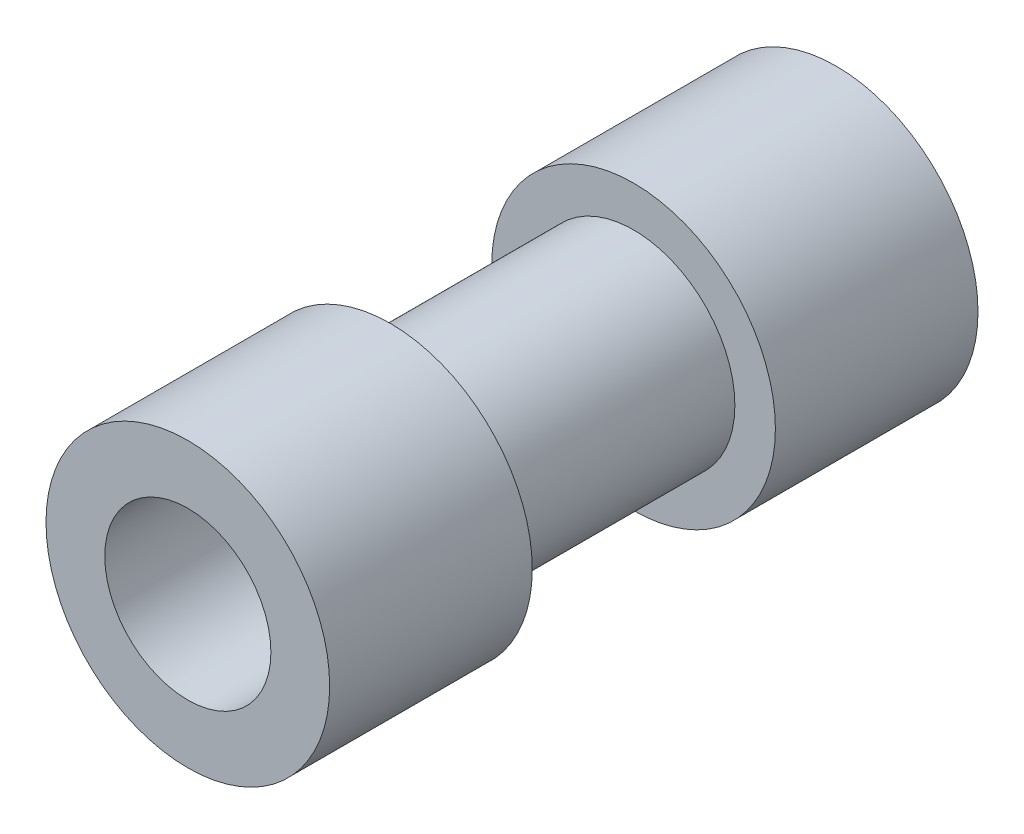
ISO-10303-21;
HEADER;
FILE_DESCRIPTION(('STEP AP214'),'2;1');
FILE_NAME('part.step','',(''),(''),'','','');
FILE_SCHEMA(('AUTOMOTIVE_DESIGN { 1 0 10303 214 1 1 1 1 }'));
ENDSEC;
DATA;
#1=APPLICATION_CONTEXT('core data for automotive mechanical design processes');
#2=APPLICATION_PROTOCOL_DEFINITION('international standard','automotive_design',2000,#1);
#3=PRODUCT_CONTEXT('',#1,'mechanical');
#4=PRODUCT('Part','Part','',(#3));
#5=PRODUCT_RELATED_PRODUCT_CATEGORY('part','',(#4));
#6=PRODUCT_DEFINITION_FORMATION('','',#4);
#7=PRODUCT_DEFINITION_CONTEXT('part definition',#1,'design');
#8=PRODUCT_DEFINITION('design','',#6,#7);
#9=PRODUCT_DEFINITION_SHAPE('','',#8);
#10=(LENGTH_UNIT() NAMED_UNIT(*) SI_UNIT(.MILLI.,.METRE.));
#11=(NAMED_UNIT(*) PLANE_ANGLE_UNIT() SI_UNIT($,.RADIAN.));
#12=(NAMED_UNIT(*) SI_UNIT($,.STERADIAN.) SOLID_ANGLE_UNIT());
#13=UNCERTAINTY_MEASURE_WITH_UNIT(LENGTH_MEASURE(1.E-05),#10,'distance_accuracy_value','');
#14=(GEOMETRIC_REPRESENTATION_CONTEXT(3) GLOBAL_UNCERTAINTY_ASSIGNED_CONTEXT((#13)) GLOBAL_UNIT_ASSIGNED_CONTEXT((#10,
#11,#12)) REPRESENTATION_CONTEXT('',''));
#15=CARTESIAN_POINT('',(0.,0.,0.));
#16=DIRECTION('',(0.,0.,1.));
#17=DIRECTION('',(1.,0.,0.));
#18=AXIS2_PLACEMENT_3D('',#15,#16,#17);
#19=CARTESIAN_POINT('',(0.,0.,2.5));
#20=DIRECTION('',(0.,0.,-1.));
#21=DIRECTION('',(-1.,0.,0.));
#22=AXIS2_PLACEMENT_3D('',#19,#20,#21);
#23=CYLINDRICAL_SURFACE('',#22,1.75);
#24=CARTESIAN_POINT('',(0.,0.,2.5));
#25=DIRECTION('',(0.,0.,1.));
#26=DIRECTION('',(1.,0.,0.));
#27=AXIS2_PLACEMENT_3D('',#24,#25,#26);
#28=CIRCLE('',#27,1.75);
#29=CARTESIAN_POINT('',(1.75,0.,2.5));
#30=VERTEX_POINT('',#29);
#31=EDGE_CURVE('E45',#30,#30,#28,.T.);
#32=ORIENTED_EDGE('',*,*,#31,.F.);
#33=EDGE_LOOP('',(#32));
#34=FACE_BOUND('',#33,.T.);
#35=CARTESIAN_POINT('',(0.,0.,0.));
#36=DIRECTION('',(0.,0.,1.));
#37=DIRECTION('',(1.,0.,0.));
#38=AXIS2_PLACEMENT_3D('',#35,#36,#37);
#39=CIRCLE('',#38,1.75);
#40=CARTESIAN_POINT('',(1.75,0.,0.));
#41=VERTEX_POINT('',#40);
#42=EDGE_CURVE('E41',#41,#41,#39,.T.);
#43=ORIENTED_EDGE('',*,*,#42,.T.);
#44=EDGE_LOOP('',(#43));
#45=FACE_BOUND('',#44,.T.);
#46=ADVANCED_FACE('F38',(#34,#45),#23,.T.);
#47=CARTESIAN_POINT('',(0.,0.,2.5));
#48=DIRECTION('',(0.,0.,1.));
#49=DIRECTION('',(1.,0.,0.));
#50=AXIS2_PLACEMENT_3D('',#47,#48,#49);
#51=PLANE('',#50);
#52=CARTESIAN_POINT('',(0.,0.,2.5));
#53=DIRECTION('',(0.,0.,1.));
#54=DIRECTION('',(1.,0.,0.));
#55=AXIS2_PLACEMENT_3D('',#52,#53,#54);
#56=CIRCLE('',#55,1.25);
#57=CARTESIAN_POINT('',(1.25,0.,2.5));
#58=VERTEX_POINT('',#57);
#59=EDGE_CURVE('E10',#58,#58,#56,.T.);
#60=ORIENTED_EDGE('',*,*,#59,.F.);
#61=EDGE_LOOP('',(#60));
#62=FACE_BOUND('',#61,.T.);
#63=ORIENTED_EDGE('',*,*,#31,.T.);
#64=EDGE_LOOP('',(#63));
#65=FACE_BOUND('',#64,.T.);
#66=ADVANCED_FACE('F92',(#62,#65),#51,.T.);
#67=CARTESIAN_POINT('',(0.,0.,0.));
#68=DIRECTION('',(0.,0.,1.));
#69=DIRECTION('',(1.,0.,0.));
#70=AXIS2_PLACEMENT_3D('',#67,#68,#69);
#71=PLANE('',#70);
#72=CARTESIAN_POINT('',(0.,0.,0.));
#73=DIRECTION('',(0.,0.,1.));
#74=DIRECTION('',(1.,0.,0.));
#75=AXIS2_PLACEMENT_3D('',#72,#73,#74);
#76=CIRCLE('',#75,1.025);
#77=CARTESIAN_POINT('',(1.025,0.,0.));
#78=VERTEX_POINT('',#77);
#79=EDGE_CURVE('E58',#78,#78,#76,.T.);
#80=ORIENTED_EDGE('',*,*,#79,.T.);
#81=EDGE_LOOP('',(#80));
#82=FACE_BOUND('',#81,.T.);
#83=ORIENTED_EDGE('',*,*,#42,.F.);
#84=EDGE_LOOP('',(#83));
#85=FACE_BOUND('',#84,.T.);
#86=ADVANCED_FACE('F97',(#82,#85),#71,.F.);
#87=CARTESIAN_POINT('',(0.,0.,5.5));
#88=DIRECTION('',(0.,0.,-1.));
#89=DIRECTION('',(-1.,0.,0.));
#90=AXIS2_PLACEMENT_3D('',#87,#88,#89);
#91=CYLINDRICAL_SURFACE('',#90,1.25);
#92=CARTESIAN_POINT('',(0.,0.,5.5));
#93=DIRECTION('',(0.,0.,1.));
#94=DIRECTION('',(1.,0.,0.));
#95=AXIS2_PLACEMENT_3D('',#92,#93,#94);
#96=CIRCLE('',#95,1.25);
#97=CARTESIAN_POINT('',(1.25,0.,5.5));
#98=VERTEX_POINT('',#97);
#99=EDGE_CURVE('E51',#98,#98,#96,.T.);
#100=ORIENTED_EDGE('',*,*,#99,.F.);
#101=EDGE_LOOP('',(#100));
#102=FACE_BOUND('',#101,.T.);
#103=ORIENTED_EDGE('',*,*,#59,.T.);
#104=EDGE_LOOP('',(#103));
#105=FACE_BOUND('',#104,.T.);
#106=ADVANCED_FACE('F79',(#102,#105),#91,.T.);
#107=CARTESIAN_POINT('',(0.,0.,8.));
#108=DIRECTION('',(0.,0.,-1.));
#109=DIRECTION('',(-1.,0.,0.));
#110=AXIS2_PLACEMENT_3D('',#107,#108,#109);
#111=CYLINDRICAL_SURFACE('',#110,1.75);
#112=CARTESIAN_POINT('',(0.,0.,8.));
#113=DIRECTION('',(0.,0.,1.));
#114=DIRECTION('',(1.,0.,0.));
#115=AXIS2_PLACEMENT_3D('',#112,#113,#114);
#116=CIRCLE('',#115,1.75);
#117=CARTESIAN_POINT('',(1.75,0.,8.));
#118=VERTEX_POINT('',#117);
#119=EDGE_CURVE('E54',#118,#118,#116,.T.);
#120=ORIENTED_EDGE('',*,*,#119,.F.);
#121=EDGE_LOOP('',(#120));
#122=FACE_BOUND('',#121,.T.);
#123=CARTESIAN_POINT('',(0.,0.,5.5));
#124=DIRECTION('',(0.,0.,1.));
#125=DIRECTION('',(1.,0.,0.));
#126=AXIS2_PLACEMENT_3D('',#123,#124,#125);
#127=CIRCLE('',#126,1.75);
#128=CARTESIAN_POINT('',(1.75,0.,5.5));
#129=VERTEX_POINT('',#128);
#130=EDGE_CURVE('E55',#129,#129,#127,.T.);
#131=ORIENTED_EDGE('',*,*,#130,.T.);
#132=EDGE_LOOP('',(#131));
#133=FACE_BOUND('',#132,.T.);
#134=ADVANCED_FACE('F73',(#122,#133),#111,.T.);
#135=CARTESIAN_POINT('',(0.,0.,8.));
#136=DIRECTION('',(0.,0.,1.));
#137=DIRECTION('',(1.,0.,0.));
#138=AXIS2_PLACEMENT_3D('',#135,#136,#137);
#139=PLANE('',#138);
#140=CARTESIAN_POINT('',(0.,0.,8.));
#141=DIRECTION('',(0.,0.,1.));
#142=DIRECTION('',(1.,0.,0.));
#143=AXIS2_PLACEMENT_3D('',#140,#141,#142);
#144=CIRCLE('',#143,1.025);
#145=CARTESIAN_POINT('',(1.025,0.,8.));
#146=VERTEX_POINT('',#145);
#147=EDGE_CURVE('E63',#146,#146,#144,.T.);
#148=ORIENTED_EDGE('',*,*,#147,.F.);
#149=EDGE_LOOP('',(#148));
#150=FACE_BOUND('',#149,.T.);
#151=ORIENTED_EDGE('',*,*,#119,.T.);
#152=EDGE_LOOP('',(#151));
#153=FACE_BOUND('',#152,.T.);
#154=ADVANCED_FACE('F69',(#150,#153),#139,.T.);
#155=CARTESIAN_POINT('',(0.,0.,5.5));
#156=DIRECTION('',(0.,0.,1.));
#157=DIRECTION('',(1.,0.,0.));
#158=AXIS2_PLACEMENT_3D('',#155,#156,#157);
#159=PLANE('',#158);
#160=ORIENTED_EDGE('',*,*,#99,.T.);
#161=EDGE_LOOP('',(#160));
#162=FACE_BOUND('',#161,.T.);
#163=ORIENTED_EDGE('',*,*,#130,.F.);
#164=EDGE_LOOP('',(#163));
#165=FACE_BOUND('',#164,.T.);
#166=ADVANCED_FACE('F72',(#162,#165),#159,.F.);
#167=CARTESIAN_POINT('',(0.,0.,8.));
#168=DIRECTION('',(0.,0.,1.));
#169=DIRECTION('',(1.,0.,0.));
#170=AXIS2_PLACEMENT_3D('',#167,#168,#169);
#171=CYLINDRICAL_SURFACE('',#170,1.025);
#172=ORIENTED_EDGE('',*,*,#79,.F.);
#173=EDGE_LOOP('',(#172));
#174=FACE_BOUND('',#173,.T.);
#175=ORIENTED_EDGE('',*,*,#147,.T.);
#176=EDGE_LOOP('',(#175));
#177=FACE_BOUND('',#176,.T.);
#178=ADVANCED_FACE('F67',(#174,#177),#171,.F.);
#179=CLOSED_SHELL('',(#46,#66,#86,#106,#134,#154,#166,#178));
#180=MANIFOLD_SOLID_BREP('B2',#179);
#181=ADVANCED_BREP_SHAPE_REPRESENTATION('',(#18,#180),#14);
#182=SHAPE_DEFINITION_REPRESENTATION(#9,#181);
ENDSEC;
END-ISO-10303-21;
